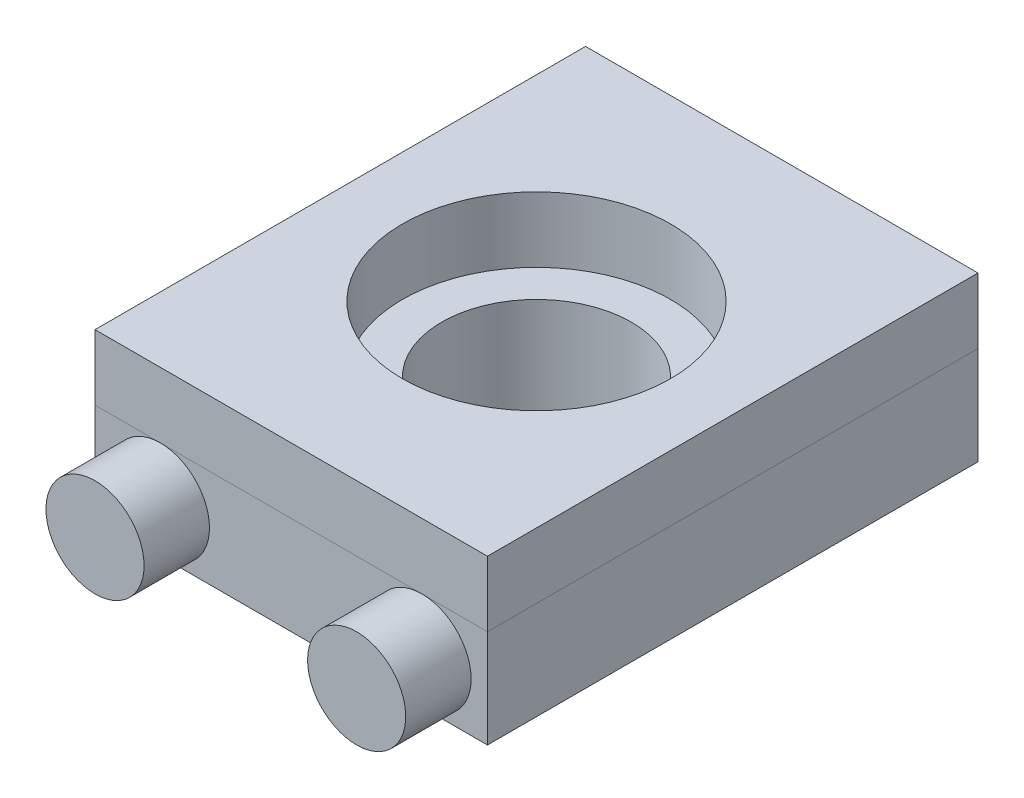
ISO-10303-21;
HEADER;
FILE_DESCRIPTION(('STEP AP214'),'2;1');
FILE_NAME('part.step','',(''),(''),'','','');
FILE_SCHEMA(('AUTOMOTIVE_DESIGN { 1 0 10303 214 1 1 1 1 }'));
ENDSEC;
DATA;
#1=APPLICATION_CONTEXT('core data for automotive mechanical design processes');
#2=APPLICATION_PROTOCOL_DEFINITION('international standard','automotive_design',2000,#1);
#3=PRODUCT_CONTEXT('',#1,'mechanical');
#4=PRODUCT('Part','Part','',(#3));
#5=PRODUCT_RELATED_PRODUCT_CATEGORY('part','',(#4));
#6=PRODUCT_DEFINITION_FORMATION('','',#4);
#7=PRODUCT_DEFINITION_CONTEXT('part definition',#1,'design');
#8=PRODUCT_DEFINITION('design','',#6,#7);
#9=PRODUCT_DEFINITION_SHAPE('','',#8);
#10=(LENGTH_UNIT() NAMED_UNIT(*) SI_UNIT(.MILLI.,.METRE.));
#11=(NAMED_UNIT(*) PLANE_ANGLE_UNIT() SI_UNIT($,.RADIAN.));
#12=(NAMED_UNIT(*) SI_UNIT($,.STERADIAN.) SOLID_ANGLE_UNIT());
#13=UNCERTAINTY_MEASURE_WITH_UNIT(LENGTH_MEASURE(1.E-05),#10,'distance_accuracy_value','');
#14=(GEOMETRIC_REPRESENTATION_CONTEXT(3) GLOBAL_UNCERTAINTY_ASSIGNED_CONTEXT((#13)) GLOBAL_UNIT_ASSIGNED_CONTEXT((#10,
#11,#12)) REPRESENTATION_CONTEXT('',''));
#15=CARTESIAN_POINT('',(0.,0.,0.));
#16=DIRECTION('',(0.,0.,1.));
#17=DIRECTION('',(1.,0.,0.));
#18=AXIS2_PLACEMENT_3D('',#15,#16,#17);
#19=CARTESIAN_POINT('',(12.,5.,0.));
#20=DIRECTION('',(-1.,0.,0.));
#21=DIRECTION('',(0.,0.,1.));
#22=AXIS2_PLACEMENT_3D('',#19,#20,#21);
#23=PLANE('',#22);
#24=DIRECTION('',(0.,0.,-1.));
#25=VECTOR('',#24,1.);
#26=CARTESIAN_POINT('',(12.,3.,0.));
#27=LINE('',#26,#25);
#28=CARTESIAN_POINT('',(12.,3.,0.));
#29=VERTEX_POINT('',#28);
#30=CARTESIAN_POINT('',(12.,3.,-15.));
#31=VERTEX_POINT('',#30);
#32=EDGE_CURVE('E139',#29,#31,#27,.T.);
#33=ORIENTED_EDGE('',*,*,#32,.T.);
#34=DIRECTION('',(0.,-1.,0.));
#35=VECTOR('',#34,1.);
#36=CARTESIAN_POINT('',(12.,5.,-15.));
#37=LINE('',#36,#35);
#38=CARTESIAN_POINT('',(12.,5.,-15.));
#39=VERTEX_POINT('',#38);
#40=EDGE_CURVE('E13',#39,#31,#37,.T.);
#41=ORIENTED_EDGE('',*,*,#40,.F.);
#42=DIRECTION('',(0.,0.,-1.));
#43=VECTOR('',#42,1.);
#44=CARTESIAN_POINT('',(12.,5.,0.));
#45=LINE('',#44,#43);
#46=CARTESIAN_POINT('',(12.,5.,0.));
#47=VERTEX_POINT('',#46);
#48=EDGE_CURVE('E124',#47,#39,#45,.T.);
#49=ORIENTED_EDGE('',*,*,#48,.F.);
#50=DIRECTION('',(0.,-1.,0.));
#51=VECTOR('',#50,1.);
#52=CARTESIAN_POINT('',(12.,5.,0.));
#53=LINE('',#52,#51);
#54=EDGE_CURVE('E132',#47,#29,#53,.T.);
#55=ORIENTED_EDGE('',*,*,#54,.T.);
#56=EDGE_LOOP('',(#33,#41,#49,#55));
#57=FACE_BOUND('',#56,.T.);
#58=ADVANCED_FACE('F72',(#57),#23,.F.);
#59=CARTESIAN_POINT('',(0.,5.,-15.));
#60=DIRECTION('',(0.,0.,1.));
#61=DIRECTION('',(1.,0.,0.));
#62=AXIS2_PLACEMENT_3D('',#59,#60,#61);
#63=PLANE('',#62);
#64=DIRECTION('',(-1.,0.,0.));
#65=VECTOR('',#64,1.);
#66=CARTESIAN_POINT('',(0.,3.,-15.));
#67=LINE('',#66,#65);
#68=CARTESIAN_POINT('',(0.,3.,-15.));
#69=VERTEX_POINT('',#68);
#70=EDGE_CURVE('E128',#31,#69,#67,.T.);
#71=ORIENTED_EDGE('',*,*,#70,.T.);
#72=DIRECTION('',(0.,-1.,0.));
#73=VECTOR('',#72,1.);
#74=CARTESIAN_POINT('',(0.,5.,-15.));
#75=LINE('',#74,#73);
#76=CARTESIAN_POINT('',(0.,5.,-15.));
#77=VERTEX_POINT('',#76);
#78=EDGE_CURVE('E81',#77,#69,#75,.T.);
#79=ORIENTED_EDGE('',*,*,#78,.F.);
#80=DIRECTION('',(-1.,0.,0.));
#81=VECTOR('',#80,1.);
#82=CARTESIAN_POINT('',(0.,5.,-15.));
#83=LINE('',#82,#81);
#84=EDGE_CURVE('E119',#39,#77,#83,.T.);
#85=ORIENTED_EDGE('',*,*,#84,.F.);
#86=ORIENTED_EDGE('',*,*,#40,.T.);
#87=EDGE_LOOP('',(#71,#79,#85,#86));
#88=FACE_BOUND('',#87,.T.);
#89=ADVANCED_FACE('F127',(#88),#63,.F.);
#90=CARTESIAN_POINT('',(0.,5.,0.));
#91=DIRECTION('',(1.,0.,0.));
#92=DIRECTION('',(0.,0.,-1.));
#93=AXIS2_PLACEMENT_3D('',#90,#91,#92);
#94=PLANE('',#93);
#95=DIRECTION('',(0.,0.,1.));
#96=VECTOR('',#95,1.);
#97=CARTESIAN_POINT('',(0.,3.,0.));
#98=LINE('',#97,#96);
#99=CARTESIAN_POINT('',(0.,3.,0.));
#100=VERTEX_POINT('',#99);
#101=EDGE_CURVE('E106',#69,#100,#98,.T.);
#102=ORIENTED_EDGE('',*,*,#101,.T.);
#103=DIRECTION('',(0.,-1.,0.));
#104=VECTOR('',#103,1.);
#105=CARTESIAN_POINT('',(0.,5.,0.));
#106=LINE('',#105,#104);
#107=CARTESIAN_POINT('',(0.,5.,0.));
#108=VERTEX_POINT('',#107);
#109=EDGE_CURVE('E129',#108,#100,#106,.T.);
#110=ORIENTED_EDGE('',*,*,#109,.F.);
#111=DIRECTION('',(0.,0.,1.));
#112=VECTOR('',#111,1.);
#113=CARTESIAN_POINT('',(0.,5.,0.));
#114=LINE('',#113,#112);
#115=EDGE_CURVE('E122',#77,#108,#114,.T.);
#116=ORIENTED_EDGE('',*,*,#115,.F.);
#117=ORIENTED_EDGE('',*,*,#78,.T.);
#118=EDGE_LOOP('',(#102,#110,#116,#117));
#119=FACE_BOUND('',#118,.T.);
#120=ADVANCED_FACE('F130',(#119),#94,.F.);
#121=CARTESIAN_POINT('',(6.,5.,-7.5));
#122=DIRECTION('',(0.,-1.,0.));
#123=DIRECTION('',(0.,0.,-1.));
#124=AXIS2_PLACEMENT_3D('',#121,#122,#123);
#125=CYLINDRICAL_SURFACE('',#124,4.1);
#126=CARTESIAN_POINT('',(6.,5.,-7.5));
#127=DIRECTION('',(0.,1.,0.));
#128=DIRECTION('',(0.,0.,1.));
#129=AXIS2_PLACEMENT_3D('',#126,#127,#128);
#130=CIRCLE('',#129,4.1);
#131=CARTESIAN_POINT('',(6.,5.,-3.4));
#132=VERTEX_POINT('',#131);
#133=EDGE_CURVE('E145',#132,#132,#130,.T.);
#134=ORIENTED_EDGE('',*,*,#133,.T.);
#135=EDGE_LOOP('',(#134));
#136=FACE_BOUND('',#135,.T.);
#137=CARTESIAN_POINT('',(6.,3.,-7.5));
#138=DIRECTION('',(0.,1.,0.));
#139=DIRECTION('',(0.,0.,1.));
#140=AXIS2_PLACEMENT_3D('',#137,#138,#139);
#141=CIRCLE('',#140,4.1);
#142=CARTESIAN_POINT('',(6.,3.,-3.4));
#143=VERTEX_POINT('',#142);
#144=EDGE_CURVE('E136',#143,#143,#141,.T.);
#145=ORIENTED_EDGE('',*,*,#144,.F.);
#146=EDGE_LOOP('',(#145));
#147=FACE_BOUND('',#146,.T.);
#148=ADVANCED_FACE('F74',(#136,#147),#125,.F.);
#149=CARTESIAN_POINT('',(0.,5.,0.));
#150=DIRECTION('',(0.,0.,-1.));
#151=DIRECTION('',(-1.,0.,0.));
#152=AXIS2_PLACEMENT_3D('',#149,#150,#151);
#153=PLANE('',#152);
#154=DIRECTION('',(1.,0.,0.));
#155=VECTOR('',#154,1.);
#156=CARTESIAN_POINT('',(0.,3.,0.));
#157=LINE('',#156,#155);
#158=EDGE_CURVE('E112',#100,#29,#157,.T.);
#159=ORIENTED_EDGE('',*,*,#158,.T.);
#160=ORIENTED_EDGE('',*,*,#54,.F.);
#161=DIRECTION('',(1.,0.,0.));
#162=VECTOR('',#161,1.);
#163=CARTESIAN_POINT('',(0.,5.,0.));
#164=LINE('',#163,#162);
#165=EDGE_CURVE('E89',#108,#47,#164,.T.);
#166=ORIENTED_EDGE('',*,*,#165,.F.);
#167=ORIENTED_EDGE('',*,*,#109,.T.);
#168=EDGE_LOOP('',(#159,#160,#166,#167));
#169=FACE_BOUND('',#168,.T.);
#170=ADVANCED_FACE('F147',(#169),#153,.F.);
#171=CARTESIAN_POINT('',(0.,5.,0.));
#172=DIRECTION('',(0.,1.,0.));
#173=DIRECTION('',(0.,0.,1.));
#174=AXIS2_PLACEMENT_3D('',#171,#172,#173);
#175=PLANE('',#174);
#176=ORIENTED_EDGE('',*,*,#133,.F.);
#177=EDGE_LOOP('',(#176));
#178=FACE_BOUND('',#177,.T.);
#179=ORIENTED_EDGE('',*,*,#48,.T.);
#180=ORIENTED_EDGE('',*,*,#84,.T.);
#181=ORIENTED_EDGE('',*,*,#115,.T.);
#182=ORIENTED_EDGE('',*,*,#165,.T.);
#183=EDGE_LOOP('',(#179,#180,#181,#182));
#184=FACE_BOUND('',#183,.T.);
#185=ADVANCED_FACE('F120',(#178,#184),#175,.T.);
#186=CARTESIAN_POINT('',(0.,3.,0.));
#187=DIRECTION('',(0.,1.,0.));
#188=DIRECTION('',(0.,0.,1.));
#189=AXIS2_PLACEMENT_3D('',#186,#187,#188);
#190=PLANE('',#189);
#191=ORIENTED_EDGE('',*,*,#144,.T.);
#192=EDGE_LOOP('',(#191));
#193=FACE_BOUND('',#192,.T.);
#194=ORIENTED_EDGE('',*,*,#32,.F.);
#195=ORIENTED_EDGE('',*,*,#158,.F.);
#196=ORIENTED_EDGE('',*,*,#101,.F.);
#197=ORIENTED_EDGE('',*,*,#70,.F.);
#198=EDGE_LOOP('',(#194,#195,#196,#197));
#199=FACE_BOUND('',#198,.T.);
#200=ADVANCED_FACE('F150',(#193,#199),#190,.F.);
#201=CLOSED_SHELL('',(#58,#89,#120,#148,#170,#185,#200));
#202=MANIFOLD_SOLID_BREP('B2',#201);
#203=CARTESIAN_POINT('',(0.,3.,0.));
#204=DIRECTION('',(0.,0.,-1.));
#205=DIRECTION('',(-1.,0.,0.));
#206=AXIS2_PLACEMENT_3D('',#203,#204,#205);
#207=PLANE('',#206);
#208=CARTESIAN_POINT('',(2.,1.5,0.));
#209=DIRECTION('',(0.,0.,1.));
#210=DIRECTION('',(1.,0.,0.));
#211=AXIS2_PLACEMENT_3D('',#208,#209,#210);
#212=CIRCLE('',#211,1.5);
#213=CARTESIAN_POINT('',(2.,3.,0.));
#214=VERTEX_POINT('',#213);
#215=CARTESIAN_POINT('',(2.,0.,0.));
#216=VERTEX_POINT('',#215);
#217=EDGE_CURVE('E241',#214,#216,#212,.T.);
#218=ORIENTED_EDGE('',*,*,#217,.F.);
#219=DIRECTION('',(1.,0.,0.));
#220=VECTOR('',#219,1.);
#221=CARTESIAN_POINT('',(0.,3.,0.));
#222=LINE('',#221,#220);
#223=CARTESIAN_POINT('',(0.,3.,0.));
#224=VERTEX_POINT('',#223);
#225=EDGE_CURVE('E339',#224,#214,#222,.T.);
#226=ORIENTED_EDGE('',*,*,#225,.F.);
#227=DIRECTION('',(0.,-1.,0.));
#228=VECTOR('',#227,1.);
#229=CARTESIAN_POINT('',(0.,3.,0.));
#230=LINE('',#229,#228);
#231=CARTESIAN_POINT('',(0.,0.,0.));
#232=VERTEX_POINT('',#231);
#233=EDGE_CURVE('E314',#224,#232,#230,.T.);
#234=ORIENTED_EDGE('',*,*,#233,.T.);
#235=DIRECTION('',(1.,0.,0.));
#236=VECTOR('',#235,1.);
#237=CARTESIAN_POINT('',(0.,0.,0.));
#238=LINE('',#237,#236);
#239=EDGE_CURVE('E287',#232,#216,#238,.T.);
#240=ORIENTED_EDGE('',*,*,#239,.T.);
#241=EDGE_LOOP('',(#218,#226,#234,#240));
#242=FACE_BOUND('',#241,.T.);
#243=ADVANCED_FACE('F229',(#242),#207,.F.);
#244=CARTESIAN_POINT('',(10.,1.5,0.));
#245=DIRECTION('',(0.,0.,1.));
#246=DIRECTION('',(-1.,0.,0.));
#247=AXIS2_PLACEMENT_3D('',#244,#245,#246);
#248=CIRCLE('',#247,1.5);
#249=CARTESIAN_POINT('',(10.,0.,0.));
#250=VERTEX_POINT('',#249);
#251=CARTESIAN_POINT('',(10.,3.,0.));
#252=VERTEX_POINT('',#251);
#253=EDGE_CURVE('E302',#250,#252,#248,.T.);
#254=ORIENTED_EDGE('',*,*,#253,.F.);
#255=CARTESIAN_POINT('',(12.,0.,0.));
#256=VERTEX_POINT('',#255);
#257=EDGE_CURVE('E288',#250,#256,#238,.T.);
#258=ORIENTED_EDGE('',*,*,#257,.T.);
#259=DIRECTION('',(0.,-1.,0.));
#260=VECTOR('',#259,1.);
#261=CARTESIAN_POINT('',(12.,3.,0.));
#262=LINE('',#261,#260);
#263=CARTESIAN_POINT('',(12.,3.,0.));
#264=VERTEX_POINT('',#263);
#265=EDGE_CURVE('E356',#264,#256,#262,.T.);
#266=ORIENTED_EDGE('',*,*,#265,.F.);
#267=EDGE_CURVE('E304',#252,#264,#222,.T.);
#268=ORIENTED_EDGE('',*,*,#267,.F.);
#269=EDGE_LOOP('',(#254,#258,#266,#268));
#270=FACE_BOUND('',#269,.T.);
#271=ADVANCED_FACE('F303',(#270),#207,.F.);
#272=CARTESIAN_POINT('',(0.,3.,0.));
#273=DIRECTION('',(0.,1.,0.));
#274=DIRECTION('',(0.,0.,1.));
#275=AXIS2_PLACEMENT_3D('',#272,#273,#274);
#276=PLANE('',#275);
#277=DIRECTION('',(1.,0.,0.));
#278=VECTOR('',#277,1.);
#279=CARTESIAN_POINT('',(0.,3.,-15.));
#280=LINE('',#279,#278);
#281=CARTESIAN_POINT('',(0.,3.,-15.));
#282=VERTEX_POINT('',#281);
#283=CARTESIAN_POINT('',(12.,3.,-15.));
#284=VERTEX_POINT('',#283);
#285=EDGE_CURVE('E331',#282,#284,#280,.T.);
#286=ORIENTED_EDGE('',*,*,#285,.F.);
#287=DIRECTION('',(0.,0.,-1.));
#288=VECTOR('',#287,1.);
#289=CARTESIAN_POINT('',(0.,3.,0.));
#290=LINE('',#289,#288);
#291=EDGE_CURVE('E342',#224,#282,#290,.T.);
#292=ORIENTED_EDGE('',*,*,#291,.F.);
#293=ORIENTED_EDGE('',*,*,#225,.T.);
#294=EDGE_CURVE('E343',#214,#252,#222,.T.);
#295=ORIENTED_EDGE('',*,*,#294,.T.);
#296=ORIENTED_EDGE('',*,*,#267,.T.);
#297=DIRECTION('',(0.,0.,-1.));
#298=VECTOR('',#297,1.);
#299=CARTESIAN_POINT('',(12.,3.,0.));
#300=LINE('',#299,#298);
#301=EDGE_CURVE('E335',#264,#284,#300,.T.);
#302=ORIENTED_EDGE('',*,*,#301,.T.);
#303=EDGE_LOOP('',(#286,#292,#293,#295,#296,#302));
#304=FACE_BOUND('',#303,.T.);
#305=CARTESIAN_POINT('',(6.,3.,-7.5));
#306=DIRECTION('',(0.,1.,0.));
#307=DIRECTION('',(0.,0.,1.));
#308=AXIS2_PLACEMENT_3D('',#305,#306,#307);
#309=CIRCLE('',#308,2.9);
#310=CARTESIAN_POINT('',(6.,3.,-4.6));
#311=VERTEX_POINT('',#310);
#312=EDGE_CURVE('E321',#311,#311,#309,.T.);
#313=ORIENTED_EDGE('',*,*,#312,.F.);
#314=EDGE_LOOP('',(#313));
#315=FACE_BOUND('',#314,.T.);
#316=ADVANCED_FACE('F372',(#304,#315),#276,.T.);
#317=CARTESIAN_POINT('',(0.,0.,0.));
#318=DIRECTION('',(0.,1.,0.));
#319=DIRECTION('',(0.,0.,1.));
#320=AXIS2_PLACEMENT_3D('',#317,#318,#319);
#321=PLANE('',#320);
#322=DIRECTION('',(1.,0.,0.));
#323=VECTOR('',#322,1.);
#324=CARTESIAN_POINT('',(0.,0.,-15.));
#325=LINE('',#324,#323);
#326=CARTESIAN_POINT('',(0.,0.,-15.));
#327=VERTEX_POINT('',#326);
#328=CARTESIAN_POINT('',(12.,0.,-15.));
#329=VERTEX_POINT('',#328);
#330=EDGE_CURVE('E325',#327,#329,#325,.T.);
#331=ORIENTED_EDGE('',*,*,#330,.T.);
#332=DIRECTION('',(0.,0.,-1.));
#333=VECTOR('',#332,1.);
#334=CARTESIAN_POINT('',(12.,0.,0.));
#335=LINE('',#334,#333);
#336=EDGE_CURVE('E296',#256,#329,#335,.T.);
#337=ORIENTED_EDGE('',*,*,#336,.F.);
#338=ORIENTED_EDGE('',*,*,#257,.F.);
#339=EDGE_CURVE('E280',#216,#250,#238,.T.);
#340=ORIENTED_EDGE('',*,*,#339,.F.);
#341=ORIENTED_EDGE('',*,*,#239,.F.);
#342=DIRECTION('',(0.,0.,-1.));
#343=VECTOR('',#342,1.);
#344=CARTESIAN_POINT('',(0.,0.,0.));
#345=LINE('',#344,#343);
#346=EDGE_CURVE('E336',#232,#327,#345,.T.);
#347=ORIENTED_EDGE('',*,*,#346,.T.);
#348=EDGE_LOOP('',(#331,#337,#338,#340,#341,#347));
#349=FACE_BOUND('',#348,.T.);
#350=CARTESIAN_POINT('',(6.,0.,-7.5));
#351=DIRECTION('',(0.,1.,0.));
#352=DIRECTION('',(0.,0.,1.));
#353=AXIS2_PLACEMENT_3D('',#350,#351,#352);
#354=CIRCLE('',#353,2.9);
#355=CARTESIAN_POINT('',(6.,0.,-4.6));
#356=VERTEX_POINT('',#355);
#357=EDGE_CURVE('E326',#356,#356,#354,.T.);
#358=ORIENTED_EDGE('',*,*,#357,.T.);
#359=EDGE_LOOP('',(#358));
#360=FACE_BOUND('',#359,.T.);
#361=ADVANCED_FACE('F293',(#349,#360),#321,.F.);
#362=CARTESIAN_POINT('',(0.,3.,-15.));
#363=DIRECTION('',(0.,0.,-1.));
#364=DIRECTION('',(-1.,0.,0.));
#365=AXIS2_PLACEMENT_3D('',#362,#363,#364);
#366=PLANE('',#365);
#367=ORIENTED_EDGE('',*,*,#330,.F.);
#368=DIRECTION('',(0.,-1.,0.));
#369=VECTOR('',#368,1.);
#370=CARTESIAN_POINT('',(0.,3.,-15.));
#371=LINE('',#370,#369);
#372=EDGE_CURVE('E312',#282,#327,#371,.T.);
#373=ORIENTED_EDGE('',*,*,#372,.F.);
#374=ORIENTED_EDGE('',*,*,#285,.T.);
#375=DIRECTION('',(0.,-1.,0.));
#376=VECTOR('',#375,1.);
#377=CARTESIAN_POINT('',(12.,3.,-15.));
#378=LINE('',#377,#376);
#379=EDGE_CURVE('E233',#284,#329,#378,.T.);
#380=ORIENTED_EDGE('',*,*,#379,.T.);
#381=EDGE_LOOP('',(#367,#373,#374,#380));
#382=FACE_BOUND('',#381,.T.);
#383=ADVANCED_FACE('F231',(#382),#366,.T.);
#384=CARTESIAN_POINT('',(0.,3.,0.));
#385=DIRECTION('',(-1.,0.,0.));
#386=DIRECTION('',(0.,0.,1.));
#387=AXIS2_PLACEMENT_3D('',#384,#385,#386);
#388=PLANE('',#387);
#389=ORIENTED_EDGE('',*,*,#346,.F.);
#390=ORIENTED_EDGE('',*,*,#233,.F.);
#391=ORIENTED_EDGE('',*,*,#291,.T.);
#392=ORIENTED_EDGE('',*,*,#372,.T.);
#393=EDGE_LOOP('',(#389,#390,#391,#392));
#394=FACE_BOUND('',#393,.T.);
#395=ADVANCED_FACE('F368',(#394),#388,.T.);
#396=EDGE_CURVE('E70',#216,#214,#212,.T.);
#397=ORIENTED_EDGE('',*,*,#396,.F.);
#398=ORIENTED_EDGE('',*,*,#339,.T.);
#399=EDGE_CURVE('E239',#252,#250,#248,.T.);
#400=ORIENTED_EDGE('',*,*,#399,.F.);
#401=ORIENTED_EDGE('',*,*,#294,.F.);
#402=EDGE_LOOP('',(#397,#398,#400,#401));
#403=FACE_BOUND('',#402,.T.);
#404=ADVANCED_FACE('F282',(#403),#207,.F.);
#405=CARTESIAN_POINT('',(12.,3.,0.));
#406=DIRECTION('',(-1.,0.,0.));
#407=DIRECTION('',(0.,0.,1.));
#408=AXIS2_PLACEMENT_3D('',#405,#406,#407);
#409=PLANE('',#408);
#410=ORIENTED_EDGE('',*,*,#336,.T.);
#411=ORIENTED_EDGE('',*,*,#379,.F.);
#412=ORIENTED_EDGE('',*,*,#301,.F.);
#413=ORIENTED_EDGE('',*,*,#265,.T.);
#414=EDGE_LOOP('',(#410,#411,#412,#413));
#415=FACE_BOUND('',#414,.T.);
#416=ADVANCED_FACE('F365',(#415),#409,.F.);
#417=CARTESIAN_POINT('',(6.,3.,-7.5));
#418=DIRECTION('',(0.,-1.,0.));
#419=DIRECTION('',(0.,0.,-1.));
#420=AXIS2_PLACEMENT_3D('',#417,#418,#419);
#421=CYLINDRICAL_SURFACE('',#420,2.9);
#422=ORIENTED_EDGE('',*,*,#312,.T.);
#423=EDGE_LOOP('',(#422));
#424=FACE_BOUND('',#423,.T.);
#425=ORIENTED_EDGE('',*,*,#357,.F.);
#426=EDGE_LOOP('',(#425));
#427=FACE_BOUND('',#426,.T.);
#428=ADVANCED_FACE('F397',(#424,#427),#421,.F.);
#429=CARTESIAN_POINT('',(10.,1.5,2.));
#430=DIRECTION('',(0.,0.,-1.));
#431=DIRECTION('',(-1.,0.,0.));
#432=AXIS2_PLACEMENT_3D('',#429,#430,#431);
#433=CYLINDRICAL_SURFACE('',#432,1.5);
#434=CARTESIAN_POINT('',(10.,1.5,2.));
#435=DIRECTION('',(0.,0.,1.));
#436=DIRECTION('',(-1.,0.,0.));
#437=AXIS2_PLACEMENT_3D('',#434,#435,#436);
#438=CIRCLE('',#437,1.5);
#439=CARTESIAN_POINT('',(8.5,1.5,2.));
#440=VERTEX_POINT('',#439);
#441=EDGE_CURVE('E308',#440,#440,#438,.T.);
#442=ORIENTED_EDGE('',*,*,#441,.F.);
#443=EDGE_LOOP('',(#442));
#444=FACE_BOUND('',#443,.T.);
#445=ORIENTED_EDGE('',*,*,#253,.T.);
#446=ORIENTED_EDGE('',*,*,#399,.T.);
#447=EDGE_LOOP('',(#445,#446));
#448=FACE_BOUND('',#447,.T.);
#449=ADVANCED_FACE('F310',(#444,#448),#433,.T.);
#450=CARTESIAN_POINT('',(10.,1.5,2.));
#451=DIRECTION('',(0.,0.,-1.));
#452=DIRECTION('',(-1.,0.,0.));
#453=AXIS2_PLACEMENT_3D('',#450,#451,#452);
#454=PLANE('',#453);
#455=ORIENTED_EDGE('',*,*,#441,.T.);
#456=EDGE_LOOP('',(#455));
#457=FACE_BOUND('',#456,.T.);
#458=ADVANCED_FACE('F408',(#457),#454,.F.);
#459=CARTESIAN_POINT('',(2.,1.5,2.));
#460=DIRECTION('',(0.,0.,-1.));
#461=DIRECTION('',(-1.,0.,0.));
#462=AXIS2_PLACEMENT_3D('',#459,#460,#461);
#463=CYLINDRICAL_SURFACE('',#462,1.5);
#464=CARTESIAN_POINT('',(2.,1.5,2.));
#465=DIRECTION('',(0.,0.,1.));
#466=DIRECTION('',(1.,0.,0.));
#467=AXIS2_PLACEMENT_3D('',#464,#465,#466);
#468=CIRCLE('',#467,1.5);
#469=CARTESIAN_POINT('',(3.5,1.5,2.));
#470=VERTEX_POINT('',#469);
#471=EDGE_CURVE('E330',#470,#470,#468,.T.);
#472=ORIENTED_EDGE('',*,*,#471,.F.);
#473=EDGE_LOOP('',(#472));
#474=FACE_BOUND('',#473,.T.);
#475=ORIENTED_EDGE('',*,*,#217,.T.);
#476=ORIENTED_EDGE('',*,*,#396,.T.);
#477=EDGE_LOOP('',(#475,#476));
#478=FACE_BOUND('',#477,.T.);
#479=ADVANCED_FACE('F382',(#474,#478),#463,.T.);
#480=CARTESIAN_POINT('',(2.,1.5,2.));
#481=DIRECTION('',(0.,0.,1.));
#482=DIRECTION('',(1.,0.,0.));
#483=AXIS2_PLACEMENT_3D('',#480,#481,#482);
#484=PLANE('',#483);
#485=ORIENTED_EDGE('',*,*,#471,.T.);
#486=EDGE_LOOP('',(#485));
#487=FACE_BOUND('',#486,.T.);
#488=ADVANCED_FACE('F416',(#487),#484,.T.);
#489=CLOSED_SHELL('',(#243,#271,#316,#361,#383,#395,#404,#416,#428,#449,#458,#479,#488));
#490=MANIFOLD_SOLID_BREP('B7',#489);
#491=ADVANCED_BREP_SHAPE_REPRESENTATION('',(#18,#202,#490),#14);
#492=SHAPE_DEFINITION_REPRESENTATION(#9,#491);
ENDSEC;
END-ISO-10303-21;
